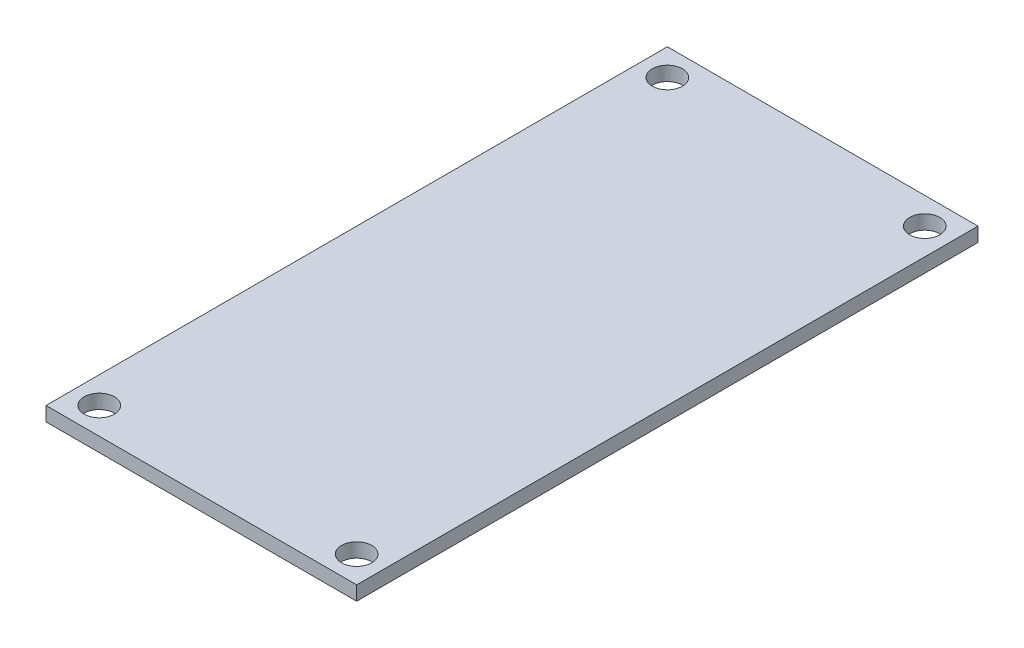
ISO-10303-21;
HEADER;
FILE_DESCRIPTION(('STEP AP214'),'2;1');
FILE_NAME('part.step','',(''),(''),'','','');
FILE_SCHEMA(('AUTOMOTIVE_DESIGN { 1 0 10303 214 1 1 1 1 }'));
ENDSEC;
DATA;
#1=APPLICATION_CONTEXT('core data for automotive mechanical design processes');
#2=APPLICATION_PROTOCOL_DEFINITION('international standard','automotive_design',2000,#1);
#3=PRODUCT_CONTEXT('',#1,'mechanical');
#4=PRODUCT('Part','Part','',(#3));
#5=PRODUCT_RELATED_PRODUCT_CATEGORY('part','',(#4));
#6=PRODUCT_DEFINITION_FORMATION('','',#4);
#7=PRODUCT_DEFINITION_CONTEXT('part definition',#1,'design');
#8=PRODUCT_DEFINITION('design','',#6,#7);
#9=PRODUCT_DEFINITION_SHAPE('','',#8);
#10=(LENGTH_UNIT() NAMED_UNIT(*) SI_UNIT(.MILLI.,.METRE.));
#11=(NAMED_UNIT(*) PLANE_ANGLE_UNIT() SI_UNIT($,.RADIAN.));
#12=(NAMED_UNIT(*) SI_UNIT($,.STERADIAN.) SOLID_ANGLE_UNIT());
#13=UNCERTAINTY_MEASURE_WITH_UNIT(LENGTH_MEASURE(1.E-05),#10,'distance_accuracy_value','');
#14=(GEOMETRIC_REPRESENTATION_CONTEXT(3) GLOBAL_UNCERTAINTY_ASSIGNED_CONTEXT((#13)) GLOBAL_UNIT_ASSIGNED_CONTEXT((#10,
#11,#12)) REPRESENTATION_CONTEXT('',''));
#15=CARTESIAN_POINT('',(0.,0.,0.));
#16=DIRECTION('',(0.,0.,1.));
#17=DIRECTION('',(1.,0.,0.));
#18=AXIS2_PLACEMENT_3D('',#15,#16,#17);
#19=CARTESIAN_POINT('',(0.,1.6,0.));
#20=DIRECTION('',(0.,-1.,0.));
#21=DIRECTION('',(0.,0.,-1.));
#22=AXIS2_PLACEMENT_3D('',#19,#20,#21);
#23=PLANE('',#22);
#24=DIRECTION('',(0.,0.,1.));
#25=VECTOR('',#24,1.);
#26=CARTESIAN_POINT('',(0.,1.6,0.));
#27=LINE('',#26,#25);
#28=CARTESIAN_POINT('',(0.,1.6,-70.));
#29=VERTEX_POINT('',#28);
#30=CARTESIAN_POINT('',(0.,1.6,0.));
#31=VERTEX_POINT('',#30);
#32=EDGE_CURVE('E85',#29,#31,#27,.T.);
#33=ORIENTED_EDGE('',*,*,#32,.T.);
#34=DIRECTION('',(1.,0.,0.));
#35=VECTOR('',#34,1.);
#36=CARTESIAN_POINT('',(0.,1.6,0.));
#37=LINE('',#36,#35);
#38=CARTESIAN_POINT('',(35.,1.6,0.));
#39=VERTEX_POINT('',#38);
#40=EDGE_CURVE('E80',#31,#39,#37,.T.);
#41=ORIENTED_EDGE('',*,*,#40,.T.);
#42=DIRECTION('',(0.,0.,-1.));
#43=VECTOR('',#42,1.);
#44=CARTESIAN_POINT('',(35.,1.6,0.));
#45=LINE('',#44,#43);
#46=CARTESIAN_POINT('',(35.,1.6,-70.));
#47=VERTEX_POINT('',#46);
#48=EDGE_CURVE('E83',#39,#47,#45,.T.);
#49=ORIENTED_EDGE('',*,*,#48,.T.);
#50=DIRECTION('',(-1.,0.,0.));
#51=VECTOR('',#50,1.);
#52=CARTESIAN_POINT('',(0.,1.6,-70.));
#53=LINE('',#52,#51);
#54=EDGE_CURVE('E50',#47,#29,#53,.T.);
#55=ORIENTED_EDGE('',*,*,#54,.T.);
#56=EDGE_LOOP('',(#33,#41,#49,#55));
#57=FACE_BOUND('',#56,.T.);
#58=CARTESIAN_POINT('',(3.00000000000001,1.6,-3.));
#59=DIRECTION('',(0.,1.,0.));
#60=DIRECTION('',(0.,0.,1.));
#61=AXIS2_PLACEMENT_3D('',#58,#59,#60);
#62=CIRCLE('',#61,1.7);
#63=CARTESIAN_POINT('',(3.00000000000001,1.6,-1.3));
#64=VERTEX_POINT('',#63);
#65=EDGE_CURVE('E100',#64,#64,#62,.T.);
#66=ORIENTED_EDGE('',*,*,#65,.F.);
#67=EDGE_LOOP('',(#66));
#68=FACE_BOUND('',#67,.T.);
#69=CARTESIAN_POINT('',(32.,1.6,-3.));
#70=DIRECTION('',(0.,1.,0.));
#71=DIRECTION('',(0.,0.,1.));
#72=AXIS2_PLACEMENT_3D('',#69,#70,#71);
#73=CIRCLE('',#72,1.7);
#74=CARTESIAN_POINT('',(32.,1.6,-1.3));
#75=VERTEX_POINT('',#74);
#76=EDGE_CURVE('E115',#75,#75,#73,.T.);
#77=ORIENTED_EDGE('',*,*,#76,.F.);
#78=EDGE_LOOP('',(#77));
#79=FACE_BOUND('',#78,.T.);
#80=CARTESIAN_POINT('',(3.,1.6,-67.));
#81=DIRECTION('',(0.,1.,0.));
#82=DIRECTION('',(0.,0.,1.));
#83=AXIS2_PLACEMENT_3D('',#80,#81,#82);
#84=CIRCLE('',#83,1.7);
#85=CARTESIAN_POINT('',(3.,1.6,-65.3));
#86=VERTEX_POINT('',#85);
#87=EDGE_CURVE('E121',#86,#86,#84,.T.);
#88=ORIENTED_EDGE('',*,*,#87,.F.);
#89=EDGE_LOOP('',(#88));
#90=FACE_BOUND('',#89,.T.);
#91=CARTESIAN_POINT('',(32.,1.6,-67.));
#92=DIRECTION('',(0.,1.,0.));
#93=DIRECTION('',(0.,0.,1.));
#94=AXIS2_PLACEMENT_3D('',#91,#92,#93);
#95=CIRCLE('',#94,1.7);
#96=CARTESIAN_POINT('',(32.,1.6,-65.3));
#97=VERTEX_POINT('',#96);
#98=EDGE_CURVE('E127',#97,#97,#95,.T.);
#99=ORIENTED_EDGE('',*,*,#98,.F.);
#100=EDGE_LOOP('',(#99));
#101=FACE_BOUND('',#100,.T.);
#102=ADVANCED_FACE('F33',(#57,#68,#79,#90,#101),#23,.F.);
#103=CARTESIAN_POINT('',(0.,0.,0.));
#104=DIRECTION('',(0.,-1.,0.));
#105=DIRECTION('',(0.,0.,-1.));
#106=AXIS2_PLACEMENT_3D('',#103,#104,#105);
#107=PLANE('',#106);
#108=CARTESIAN_POINT('',(3.,0.,-67.));
#109=DIRECTION('',(0.,1.,0.));
#110=DIRECTION('',(0.,0.,1.));
#111=AXIS2_PLACEMENT_3D('',#108,#109,#110);
#112=CIRCLE('',#111,1.7);
#113=CARTESIAN_POINT('',(3.,0.,-65.3));
#114=VERTEX_POINT('',#113);
#115=EDGE_CURVE('E124',#114,#114,#112,.T.);
#116=ORIENTED_EDGE('',*,*,#115,.T.);
#117=EDGE_LOOP('',(#116));
#118=FACE_BOUND('',#117,.T.);
#119=CARTESIAN_POINT('',(3.00000000000001,0.,-3.));
#120=DIRECTION('',(0.,1.,0.));
#121=DIRECTION('',(0.,0.,1.));
#122=AXIS2_PLACEMENT_3D('',#119,#120,#121);
#123=CIRCLE('',#122,1.7);
#124=CARTESIAN_POINT('',(3.00000000000001,0.,-1.3));
#125=VERTEX_POINT('',#124);
#126=EDGE_CURVE('E112',#125,#125,#123,.T.);
#127=ORIENTED_EDGE('',*,*,#126,.T.);
#128=EDGE_LOOP('',(#127));
#129=FACE_BOUND('',#128,.T.);
#130=DIRECTION('',(0.,0.,1.));
#131=VECTOR('',#130,1.);
#132=CARTESIAN_POINT('',(0.,0.,0.));
#133=LINE('',#132,#131);
#134=CARTESIAN_POINT('',(0.,0.,-70.));
#135=VERTEX_POINT('',#134);
#136=CARTESIAN_POINT('',(0.,0.,0.));
#137=VERTEX_POINT('',#136);
#138=EDGE_CURVE('E97',#135,#137,#133,.T.);
#139=ORIENTED_EDGE('',*,*,#138,.F.);
#140=DIRECTION('',(-1.,0.,0.));
#141=VECTOR('',#140,1.);
#142=CARTESIAN_POINT('',(0.,0.,-70.));
#143=LINE('',#142,#141);
#144=CARTESIAN_POINT('',(35.,0.,-70.));
#145=VERTEX_POINT('',#144);
#146=EDGE_CURVE('E73',#145,#135,#143,.T.);
#147=ORIENTED_EDGE('',*,*,#146,.F.);
#148=DIRECTION('',(0.,0.,-1.));
#149=VECTOR('',#148,1.);
#150=CARTESIAN_POINT('',(35.,0.,0.));
#151=LINE('',#150,#149);
#152=CARTESIAN_POINT('',(35.,0.,0.));
#153=VERTEX_POINT('',#152);
#154=EDGE_CURVE('E67',#153,#145,#151,.T.);
#155=ORIENTED_EDGE('',*,*,#154,.F.);
#156=DIRECTION('',(1.,0.,0.));
#157=VECTOR('',#156,1.);
#158=CARTESIAN_POINT('',(0.,0.,0.));
#159=LINE('',#158,#157);
#160=EDGE_CURVE('E89',#137,#153,#159,.T.);
#161=ORIENTED_EDGE('',*,*,#160,.F.);
#162=EDGE_LOOP('',(#139,#147,#155,#161));
#163=FACE_BOUND('',#162,.T.);
#164=CARTESIAN_POINT('',(32.,0.,-3.));
#165=DIRECTION('',(0.,1.,0.));
#166=DIRECTION('',(0.,0.,1.));
#167=AXIS2_PLACEMENT_3D('',#164,#165,#166);
#168=CIRCLE('',#167,1.7);
#169=CARTESIAN_POINT('',(32.,0.,-1.3));
#170=VERTEX_POINT('',#169);
#171=EDGE_CURVE('E118',#170,#170,#168,.T.);
#172=ORIENTED_EDGE('',*,*,#171,.T.);
#173=EDGE_LOOP('',(#172));
#174=FACE_BOUND('',#173,.T.);
#175=CARTESIAN_POINT('',(32.,0.,-67.));
#176=DIRECTION('',(0.,1.,0.));
#177=DIRECTION('',(0.,0.,1.));
#178=AXIS2_PLACEMENT_3D('',#175,#176,#177);
#179=CIRCLE('',#178,1.7);
#180=CARTESIAN_POINT('',(32.,0.,-65.3));
#181=VERTEX_POINT('',#180);
#182=EDGE_CURVE('E130',#181,#181,#179,.T.);
#183=ORIENTED_EDGE('',*,*,#182,.T.);
#184=EDGE_LOOP('',(#183));
#185=FACE_BOUND('',#184,.T.);
#186=ADVANCED_FACE('F108',(#118,#129,#163,#174,#185),#107,.T.);
#187=CARTESIAN_POINT('',(0.,1.6,0.));
#188=DIRECTION('',(1.,0.,0.));
#189=DIRECTION('',(0.,0.,-1.));
#190=AXIS2_PLACEMENT_3D('',#187,#188,#189);
#191=PLANE('',#190);
#192=ORIENTED_EDGE('',*,*,#138,.T.);
#193=DIRECTION('',(0.,-1.,0.));
#194=VECTOR('',#193,1.);
#195=CARTESIAN_POINT('',(0.,1.6,0.));
#196=LINE('',#195,#194);
#197=EDGE_CURVE('E11',#31,#137,#196,.T.);
#198=ORIENTED_EDGE('',*,*,#197,.F.);
#199=ORIENTED_EDGE('',*,*,#32,.F.);
#200=DIRECTION('',(0.,-1.,0.));
#201=VECTOR('',#200,1.);
#202=CARTESIAN_POINT('',(0.,1.6,-70.));
#203=LINE('',#202,#201);
#204=EDGE_CURVE('E93',#29,#135,#203,.T.);
#205=ORIENTED_EDGE('',*,*,#204,.T.);
#206=EDGE_LOOP('',(#192,#198,#199,#205));
#207=FACE_BOUND('',#206,.T.);
#208=ADVANCED_FACE('F35',(#207),#191,.F.);
#209=CARTESIAN_POINT('',(0.,1.6,0.));
#210=DIRECTION('',(0.,0.,-1.));
#211=DIRECTION('',(-1.,0.,0.));
#212=AXIS2_PLACEMENT_3D('',#209,#210,#211);
#213=PLANE('',#212);
#214=ORIENTED_EDGE('',*,*,#160,.T.);
#215=DIRECTION('',(0.,-1.,0.));
#216=VECTOR('',#215,1.);
#217=CARTESIAN_POINT('',(35.,1.6,0.));
#218=LINE('',#217,#216);
#219=EDGE_CURVE('E42',#39,#153,#218,.T.);
#220=ORIENTED_EDGE('',*,*,#219,.F.);
#221=ORIENTED_EDGE('',*,*,#40,.F.);
#222=ORIENTED_EDGE('',*,*,#197,.T.);
#223=EDGE_LOOP('',(#214,#220,#221,#222));
#224=FACE_BOUND('',#223,.T.);
#225=ADVANCED_FACE('F88',(#224),#213,.F.);
#226=CARTESIAN_POINT('',(35.,1.6,0.));
#227=DIRECTION('',(-1.,0.,0.));
#228=DIRECTION('',(0.,0.,1.));
#229=AXIS2_PLACEMENT_3D('',#226,#227,#228);
#230=PLANE('',#229);
#231=ORIENTED_EDGE('',*,*,#154,.T.);
#232=DIRECTION('',(0.,-1.,0.));
#233=VECTOR('',#232,1.);
#234=CARTESIAN_POINT('',(35.,1.6,-70.));
#235=LINE('',#234,#233);
#236=EDGE_CURVE('E90',#47,#145,#235,.T.);
#237=ORIENTED_EDGE('',*,*,#236,.F.);
#238=ORIENTED_EDGE('',*,*,#48,.F.);
#239=ORIENTED_EDGE('',*,*,#219,.T.);
#240=EDGE_LOOP('',(#231,#237,#238,#239));
#241=FACE_BOUND('',#240,.T.);
#242=ADVANCED_FACE('F91',(#241),#230,.F.);
#243=CARTESIAN_POINT('',(0.,1.6,-70.));
#244=DIRECTION('',(0.,0.,1.));
#245=DIRECTION('',(1.,0.,0.));
#246=AXIS2_PLACEMENT_3D('',#243,#244,#245);
#247=PLANE('',#246);
#248=ORIENTED_EDGE('',*,*,#146,.T.);
#249=ORIENTED_EDGE('',*,*,#204,.F.);
#250=ORIENTED_EDGE('',*,*,#54,.F.);
#251=ORIENTED_EDGE('',*,*,#236,.T.);
#252=EDGE_LOOP('',(#248,#249,#250,#251));
#253=FACE_BOUND('',#252,.T.);
#254=ADVANCED_FACE('F105',(#253),#247,.F.);
#255=CARTESIAN_POINT('',(3.00000000000001,1.6,-3.));
#256=DIRECTION('',(0.,-1.,0.));
#257=DIRECTION('',(0.,0.,-1.));
#258=AXIS2_PLACEMENT_3D('',#255,#256,#257);
#259=CYLINDRICAL_SURFACE('',#258,1.7);
#260=ORIENTED_EDGE('',*,*,#65,.T.);
#261=EDGE_LOOP('',(#260));
#262=FACE_BOUND('',#261,.T.);
#263=ORIENTED_EDGE('',*,*,#126,.F.);
#264=EDGE_LOOP('',(#263));
#265=FACE_BOUND('',#264,.T.);
#266=ADVANCED_FACE('F147',(#262,#265),#259,.F.);
#267=CARTESIAN_POINT('',(32.,1.6,-3.));
#268=DIRECTION('',(0.,-1.,0.));
#269=DIRECTION('',(0.,0.,-1.));
#270=AXIS2_PLACEMENT_3D('',#267,#268,#269);
#271=CYLINDRICAL_SURFACE('',#270,1.7);
#272=ORIENTED_EDGE('',*,*,#76,.T.);
#273=EDGE_LOOP('',(#272));
#274=FACE_BOUND('',#273,.T.);
#275=ORIENTED_EDGE('',*,*,#171,.F.);
#276=EDGE_LOOP('',(#275));
#277=FACE_BOUND('',#276,.T.);
#278=ADVANCED_FACE('F193',(#274,#277),#271,.F.);
#279=CARTESIAN_POINT('',(3.,1.6,-67.));
#280=DIRECTION('',(0.,-1.,0.));
#281=DIRECTION('',(0.,0.,-1.));
#282=AXIS2_PLACEMENT_3D('',#279,#280,#281);
#283=CYLINDRICAL_SURFACE('',#282,1.7);
#284=ORIENTED_EDGE('',*,*,#87,.T.);
#285=EDGE_LOOP('',(#284));
#286=FACE_BOUND('',#285,.T.);
#287=ORIENTED_EDGE('',*,*,#115,.F.);
#288=EDGE_LOOP('',(#287));
#289=FACE_BOUND('',#288,.T.);
#290=ADVANCED_FACE('F201',(#286,#289),#283,.F.);
#291=CARTESIAN_POINT('',(32.,1.6,-67.));
#292=DIRECTION('',(0.,-1.,0.));
#293=DIRECTION('',(0.,0.,-1.));
#294=AXIS2_PLACEMENT_3D('',#291,#292,#293);
#295=CYLINDRICAL_SURFACE('',#294,1.7);
#296=ORIENTED_EDGE('',*,*,#98,.T.);
#297=EDGE_LOOP('',(#296));
#298=FACE_BOUND('',#297,.T.);
#299=ORIENTED_EDGE('',*,*,#182,.F.);
#300=EDGE_LOOP('',(#299));
#301=FACE_BOUND('',#300,.T.);
#302=ADVANCED_FACE('F136',(#298,#301),#295,.F.);
#303=CLOSED_SHELL('',(#102,#186,#208,#225,#242,#254,#266,#278,#290,#302));
#304=MANIFOLD_SOLID_BREP('B2',#303);
#305=ADVANCED_BREP_SHAPE_REPRESENTATION('',(#18,#304),#14);
#306=SHAPE_DEFINITION_REPRESENTATION(#9,#305);
ENDSEC;
END-ISO-10303-21;
